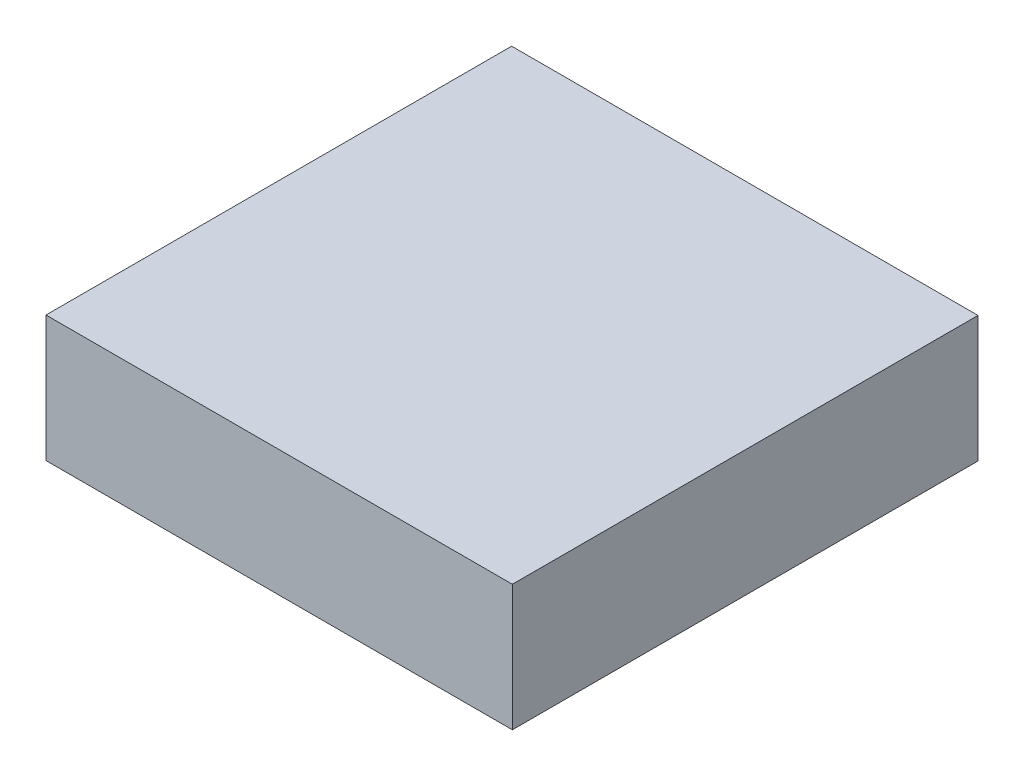
ISO-10303-21;
HEADER;
FILE_DESCRIPTION(('STEP AP214'),'2;1');
FILE_NAME('part.step','',(''),(''),'','','');
FILE_SCHEMA(('AUTOMOTIVE_DESIGN { 1 0 10303 214 1 1 1 1 }'));
ENDSEC;
DATA;
#1=APPLICATION_CONTEXT('core data for automotive mechanical design processes');
#2=APPLICATION_PROTOCOL_DEFINITION('international standard','automotive_design',2000,#1);
#3=PRODUCT_CONTEXT('',#1,'mechanical');
#4=PRODUCT('Part','Part','',(#3));
#5=PRODUCT_RELATED_PRODUCT_CATEGORY('part','',(#4));
#6=PRODUCT_DEFINITION_FORMATION('','',#4);
#7=PRODUCT_DEFINITION_CONTEXT('part definition',#1,'design');
#8=PRODUCT_DEFINITION('design','',#6,#7);
#9=PRODUCT_DEFINITION_SHAPE('','',#8);
#10=(LENGTH_UNIT() NAMED_UNIT(*) SI_UNIT(.MILLI.,.METRE.));
#11=(NAMED_UNIT(*) PLANE_ANGLE_UNIT() SI_UNIT($,.RADIAN.));
#12=(NAMED_UNIT(*) SI_UNIT($,.STERADIAN.) SOLID_ANGLE_UNIT());
#13=UNCERTAINTY_MEASURE_WITH_UNIT(LENGTH_MEASURE(1.E-05),#10,'distance_accuracy_value','');
#14=(GEOMETRIC_REPRESENTATION_CONTEXT(3) GLOBAL_UNCERTAINTY_ASSIGNED_CONTEXT((#13)) GLOBAL_UNIT_ASSIGNED_CONTEXT((#10,
#11,#12)) REPRESENTATION_CONTEXT('',''));
#15=CARTESIAN_POINT('',(0.,0.,0.));
#16=DIRECTION('',(0.,0.,1.));
#17=DIRECTION('',(1.,0.,0.));
#18=AXIS2_PLACEMENT_3D('',#15,#16,#17);
#19=CARTESIAN_POINT('',(0.,1.,0.));
#20=DIRECTION('',(0.,1.,0.));
#21=DIRECTION('',(0.,0.,1.));
#22=AXIS2_PLACEMENT_3D('',#19,#20,#21);
#23=PLANE('',#22);
#24=DIRECTION('',(1.,0.,0.));
#25=VECTOR('',#24,1.);
#26=CARTESIAN_POINT('',(-45.1650018127379,1.,-46.0180187455828));
#27=LINE('',#26,#25);
#28=CARTESIAN_POINT('',(-45.1650018127379,1.,-46.0180187455828));
#29=VERTEX_POINT('',#28);
#30=CARTESIAN_POINT('',(45.1650018127379,1.,-46.0180187455828));
#31=VERTEX_POINT('',#30);
#32=EDGE_CURVE('E165',#29,#31,#27,.T.);
#33=ORIENTED_EDGE('',*,*,#32,.T.);
#34=DIRECTION('',(0.,0.,1.));
#35=VECTOR('',#34,1.);
#36=CARTESIAN_POINT('',(45.1650018127379,1.,46.0180187455828));
#37=LINE('',#36,#35);
#38=CARTESIAN_POINT('',(45.1650018127379,1.,46.0180187455828));
#39=VERTEX_POINT('',#38);
#40=EDGE_CURVE('E188',#31,#39,#37,.T.);
#41=ORIENTED_EDGE('',*,*,#40,.T.);
#42=DIRECTION('',(-1.,0.,0.));
#43=VECTOR('',#42,1.);
#44=CARTESIAN_POINT('',(-45.1650018127379,1.,46.0180187455828));
#45=LINE('',#44,#43);
#46=CARTESIAN_POINT('',(-45.1650018127379,1.,46.0180187455828));
#47=VERTEX_POINT('',#46);
#48=EDGE_CURVE('E171',#39,#47,#45,.T.);
#49=ORIENTED_EDGE('',*,*,#48,.T.);
#50=DIRECTION('',(0.,0.,-1.));
#51=VECTOR('',#50,1.);
#52=CARTESIAN_POINT('',(-45.1650018127379,1.,46.0180187455828));
#53=LINE('',#52,#51);
#54=EDGE_CURVE('E193',#47,#29,#53,.T.);
#55=ORIENTED_EDGE('',*,*,#54,.T.);
#56=EDGE_LOOP('',(#33,#41,#49,#55));
#57=FACE_BOUND('',#56,.T.);
#58=CARTESIAN_POINT('',(-24.4178466235232,1.,12.4688207388877));
#59=DIRECTION('',(0.,1.,0.));
#60=DIRECTION('',(0.,0.,1.));
#61=AXIS2_PLACEMENT_3D('',#58,#59,#60);
#62=CIRCLE('',#61,15.8541019662497);
#63=CARTESIAN_POINT('',(-11.8736168002827,1.,22.163914719761));
#64=VERTEX_POINT('',#63);
#65=CARTESIAN_POINT('',(-26.5983195318966,1.,-3.23462114663824));
#66=VERTEX_POINT('',#65);
#67=EDGE_CURVE('E76',#64,#66,#62,.F.);
#68=ORIENTED_EDGE('',*,*,#67,.F.);
#69=CARTESIAN_POINT('',(0.110261329124484,1.,31.4259281201119));
#70=DIRECTION('',(0.,-1.,0.));
#71=DIRECTION('',(0.,0.,-1.));
#72=AXIS2_PLACEMENT_3D('',#69,#70,#71);
#73=CIRCLE('',#72,15.1458980337503);
#74=CARTESIAN_POINT('',(12.0608111713512,1.,22.1209517248051));
#75=VERTEX_POINT('',#74);
#76=EDGE_CURVE('E262',#75,#64,#73,.F.);
#77=ORIENTED_EDGE('',*,*,#76,.F.);
#78=CARTESIAN_POINT('',(24.5701543168826,1.,12.380885851127));
#79=DIRECTION('',(0.,1.,0.));
#80=DIRECTION('',(0.,0.,1.));
#81=AXIS2_PLACEMENT_3D('',#78,#79,#80);
#82=CIRCLE('',#81,15.8541019662497);
#83=CARTESIAN_POINT('',(26.6942370847762,1.,-3.3302828371463));
#84=VERTEX_POINT('',#83);
#85=EDGE_CURVE('E265',#84,#75,#82,.F.);
#86=ORIENTED_EDGE('',*,*,#85,.F.);
#87=CARTESIAN_POINT('',(28.7234369149684,1.,-18.3396324332451));
#88=DIRECTION('',(0.,-1.,0.));
#89=DIRECTION('',(0.,0.,-1.));
#90=AXIS2_PLACEMENT_3D('',#87,#88,#89);
#91=CIRCLE('',#90,15.1458980337503);
#92=CARTESIAN_POINT('',(14.6898160539048,1.,-24.0366239881521));
#93=VERTEX_POINT('',#92);
#94=EDGE_CURVE('E269',#93,#84,#91,.F.);
#95=ORIENTED_EDGE('',*,*,#94,.F.);
#96=CARTESIAN_POINT('',(0.,1.,-30.));
#97=DIRECTION('',(0.,1.,0.));
#98=DIRECTION('',(0.,0.,1.));
#99=AXIS2_PLACEMENT_3D('',#96,#97,#98);
#100=CIRCLE('',#99,15.8541019662497);
#101=CARTESIAN_POINT('',(-14.6683125911341,1.,-23.9839252926));
#102=VERTEX_POINT('',#101);
#103=EDGE_CURVE('E273',#102,#93,#100,.F.);
#104=ORIENTED_EDGE('',*,*,#103,.F.);
#105=CARTESIAN_POINT('',(-28.6813905507334,1.,-18.2365890968521));
#106=DIRECTION('',(0.,-1.,0.));
#107=DIRECTION('',(0.,0.,-1.));
#108=AXIS2_PLACEMENT_3D('',#105,#106,#107);
#109=CIRCLE('',#108,15.1458980337503);
#110=EDGE_CURVE('E277',#66,#102,#109,.F.);
#111=ORIENTED_EDGE('',*,*,#110,.F.);
#112=EDGE_LOOP('',(#68,#77,#86,#95,#104,#111));
#113=FACE_BOUND('',#112,.T.);
#114=ADVANCED_FACE('F51',(#57,#113),#23,.F.);
#115=CARTESIAN_POINT('',(-24.4178466235232,0.,12.4688207388877));
#116=DIRECTION('',(0.,1.,0.));
#117=DIRECTION('',(0.,0.,1.));
#118=AXIS2_PLACEMENT_3D('',#115,#116,#117);
#119=TOROIDAL_SURFACE('',#118,12.5,3.5);
#120=CARTESIAN_POINT('',(-14.5274805135846,0.,20.1128156506717));
#121=DIRECTION('',(0.611519592942715,0.,-0.791229288795085));
#122=DIRECTION('',(-0.791229288795086,0.,-0.611519592942715));
#123=AXIS2_PLACEMENT_3D('',#120,#121,#122);
#124=CIRCLE('',#123,3.5);
#125=CARTESIAN_POINT('',(-14.5274805135846,-3.5,20.1128156506717));
#126=VERTEX_POINT('',#125);
#127=EDGE_CURVE('E322',#64,#126,#124,.T.);
#128=ORIENTED_EDGE('',*,*,#127,.F.);
#129=ORIENTED_EDGE('',*,*,#67,.T.);
#130=CARTESIAN_POINT('',(-26.1370175619144,0.,0.0876070954442532));
#131=DIRECTION('',(-0.990497091475478,0.,0.137533675071299));
#132=DIRECTION('',(0.137533675071299,0.,0.990497091475478));
#133=AXIS2_PLACEMENT_3D('',#130,#131,#132);
#134=CIRCLE('',#133,3.5);
#135=CARTESIAN_POINT('',(-26.1370175619144,-3.5,0.0876070954442523));
#136=VERTEX_POINT('',#135);
#137=EDGE_CURVE('E319',#66,#136,#134,.T.);
#138=ORIENTED_EDGE('',*,*,#137,.T.);
#139=CARTESIAN_POINT('',(-24.4178466235232,-3.5,12.4688207388877));
#140=DIRECTION('',(0.,1.,0.));
#141=DIRECTION('',(0.,0.,1.));
#142=AXIS2_PLACEMENT_3D('',#139,#140,#141);
#143=CIRCLE('',#142,12.5);
#144=EDGE_CURVE('E283',#126,#136,#143,.F.);
#145=ORIENTED_EDGE('',*,*,#144,.F.);
#146=EDGE_LOOP('',(#128,#129,#138,#145));
#147=FACE_BOUND('',#146,.T.);
#148=ADVANCED_FACE('F372',(#147),#119,.T.);
#149=CARTESIAN_POINT('',(-28.6813905507334,0.,-18.2365890968521));
#150=DIRECTION('',(0.,-1.,0.));
#151=DIRECTION('',(0.,0.,-1.));
#152=AXIS2_PLACEMENT_3D('',#149,#150,#151);
#153=TOROIDAL_SURFACE('',#152,18.5,3.5);
#154=ORIENTED_EDGE('',*,*,#137,.F.);
#155=ORIENTED_EDGE('',*,*,#110,.T.);
#156=CARTESIAN_POINT('',(-11.5650768349732,0.,-25.2566891519565));
#157=DIRECTION('',(0.379464867843479,0.,0.925206146797853));
#158=DIRECTION('',(0.925206146797853,0.,-0.379464867843479));
#159=AXIS2_PLACEMENT_3D('',#156,#157,#158);
#160=CIRCLE('',#159,3.5);
#161=CARTESIAN_POINT('',(-11.5650768349732,-3.5,-25.2566891519565));
#162=VERTEX_POINT('',#161);
#163=EDGE_CURVE('E316',#102,#162,#160,.T.);
#164=ORIENTED_EDGE('',*,*,#163,.T.);
#165=CARTESIAN_POINT('',(-28.6813905507334,-3.5,-18.2365890968521));
#166=DIRECTION('',(0.,1.,0.));
#167=DIRECTION('',(0.,0.,1.));
#168=AXIS2_PLACEMENT_3D('',#165,#166,#167);
#169=CIRCLE('',#168,18.5);
#170=EDGE_CURVE('E287',#136,#162,#169,.T.);
#171=ORIENTED_EDGE('',*,*,#170,.F.);
#172=EDGE_LOOP('',(#154,#155,#164,#171));
#173=FACE_BOUND('',#172,.T.);
#174=ADVANCED_FACE('F380',(#173),#153,.T.);
#175=CARTESIAN_POINT('',(0.,0.,-30.));
#176=DIRECTION('',(0.,1.,0.));
#177=DIRECTION('',(0.,0.,1.));
#178=AXIS2_PLACEMENT_3D('',#175,#176,#177);
#179=TOROIDAL_SURFACE('',#178,12.5,3.5);
#180=ORIENTED_EDGE('',*,*,#163,.F.);
#181=ORIENTED_EDGE('',*,*,#103,.T.);
#182=CARTESIAN_POINT('',(11.5820310141002,0.,-25.298238884373));
#183=DIRECTION('',(0.37614088925016,0.,-0.926562481128013));
#184=DIRECTION('',(-0.926562481128013,0.,-0.37614088925016));
#185=AXIS2_PLACEMENT_3D('',#182,#183,#184);
#186=CIRCLE('',#185,3.5);
#187=CARTESIAN_POINT('',(11.5820310141002,-3.5,-25.298238884373));
#188=VERTEX_POINT('',#187);
#189=EDGE_CURVE('E313',#93,#188,#186,.T.);
#190=ORIENTED_EDGE('',*,*,#189,.T.);
#191=CARTESIAN_POINT('',(0.,-3.5,-30.));
#192=DIRECTION('',(0.,1.,0.));
#193=DIRECTION('',(0.,0.,1.));
#194=AXIS2_PLACEMENT_3D('',#191,#192,#193);
#195=CIRCLE('',#194,12.5);
#196=EDGE_CURVE('E291',#162,#188,#195,.F.);
#197=ORIENTED_EDGE('',*,*,#196,.F.);
#198=EDGE_LOOP('',(#180,#181,#190,#197));
#199=FACE_BOUND('',#198,.T.);
#200=ADVANCED_FACE('F434',(#199),#179,.T.);
#201=CARTESIAN_POINT('',(28.7234369149684,0.,-18.3396324332451));
#202=DIRECTION('',(0.,-1.,0.));
#203=DIRECTION('',(0.,0.,-1.));
#204=AXIS2_PLACEMENT_3D('',#201,#202,#203);
#205=TOROIDAL_SURFACE('',#204,18.5,3.5);
#206=ORIENTED_EDGE('',*,*,#189,.F.);
#207=ORIENTED_EDGE('',*,*,#94,.T.);
#208=CARTESIAN_POINT('',(26.2448650419172,0.,-0.00641990870043925));
#209=DIRECTION('',(-0.990984460786196,0.,-0.133976858002766));
#210=DIRECTION('',(-0.133976858002766,0.,0.990984460786196));
#211=AXIS2_PLACEMENT_3D('',#208,#209,#210);
#212=CIRCLE('',#211,3.5);
#213=CARTESIAN_POINT('',(26.2448650419172,-3.5,-0.00641990870043945));
#214=VERTEX_POINT('',#213);
#215=EDGE_CURVE('E310',#84,#214,#212,.T.);
#216=ORIENTED_EDGE('',*,*,#215,.T.);
#217=CARTESIAN_POINT('',(28.7234369149684,-3.5,-18.3396324332451));
#218=DIRECTION('',(0.,1.,0.));
#219=DIRECTION('',(0.,0.,1.));
#220=AXIS2_PLACEMENT_3D('',#217,#218,#219);
#221=CIRCLE('',#220,18.5);
#222=EDGE_CURVE('E295',#188,#214,#221,.T.);
#223=ORIENTED_EDGE('',*,*,#222,.F.);
#224=EDGE_LOOP('',(#206,#207,#216,#223));
#225=FACE_BOUND('',#224,.T.);
#226=ADVANCED_FACE('F427',(#225),#205,.T.);
#227=CARTESIAN_POINT('',(24.5701543168826,0.,12.380885851127));
#228=DIRECTION('',(0.,1.,0.));
#229=DIRECTION('',(0.,0.,1.));
#230=AXIS2_PLACEMENT_3D('',#227,#228,#229);
#231=TOROIDAL_SURFACE('',#230,12.5,3.5);
#232=ORIENTED_EDGE('',*,*,#215,.F.);
#233=ORIENTED_EDGE('',*,*,#85,.T.);
#234=CARTESIAN_POINT('',(14.7072942411737,0.,20.0603383789435));
#235=DIRECTION('',(0.61435620222532,0.,0.789028806056713));
#236=DIRECTION('',(0.789028806056713,0.,-0.61435620222532));
#237=AXIS2_PLACEMENT_3D('',#234,#235,#236);
#238=CIRCLE('',#237,3.5);
#239=CARTESIAN_POINT('',(14.7072942411737,-3.5,20.0603383789435));
#240=VERTEX_POINT('',#239);
#241=EDGE_CURVE('E307',#75,#240,#238,.T.);
#242=ORIENTED_EDGE('',*,*,#241,.T.);
#243=CARTESIAN_POINT('',(24.5701543168826,-3.5,12.380885851127));
#244=DIRECTION('',(0.,1.,0.));
#245=DIRECTION('',(0.,0.,1.));
#246=AXIS2_PLACEMENT_3D('',#243,#244,#245);
#247=CIRCLE('',#246,12.5);
#248=EDGE_CURVE('E299',#214,#240,#247,.F.);
#249=ORIENTED_EDGE('',*,*,#248,.F.);
#250=EDGE_LOOP('',(#232,#233,#242,#249));
#251=FACE_BOUND('',#250,.T.);
#252=ADVANCED_FACE('F408',(#251),#231,.T.);
#253=CARTESIAN_POINT('',(0.110261329124484,0.,31.4259281201119));
#254=DIRECTION('',(0.,-1.,0.));
#255=DIRECTION('',(0.,0.,-1.));
#256=AXIS2_PLACEMENT_3D('',#253,#254,#255);
#257=TOROIDAL_SURFACE('',#256,18.5,3.5);
#258=ORIENTED_EDGE('',*,*,#241,.F.);
#259=ORIENTED_EDGE('',*,*,#76,.T.);
#260=ORIENTED_EDGE('',*,*,#127,.T.);
#261=CARTESIAN_POINT('',(0.110261329124484,-3.5,31.4259281201119));
#262=DIRECTION('',(0.,1.,0.));
#263=DIRECTION('',(0.,0.,1.));
#264=AXIS2_PLACEMENT_3D('',#261,#262,#263);
#265=CIRCLE('',#264,18.5);
#266=EDGE_CURVE('E303',#240,#126,#265,.T.);
#267=ORIENTED_EDGE('',*,*,#266,.F.);
#268=EDGE_LOOP('',(#258,#259,#260,#267));
#269=FACE_BOUND('',#268,.T.);
#270=ADVANCED_FACE('F398',(#269),#257,.T.);
#271=CARTESIAN_POINT('',(24.5701543168826,3.5,12.380885851127));
#272=DIRECTION('',(0.,-1.,0.));
#273=DIRECTION('',(0.,0.,-1.));
#274=AXIS2_PLACEMENT_3D('',#271,#272,#273);
#275=CYLINDRICAL_SURFACE('',#274,11.);
#276=CARTESIAN_POINT('',(24.5701543168826,-3.,12.380885851127));
#277=DIRECTION('',(0.,1.,0.));
#278=DIRECTION('',(0.,0.,1.));
#279=AXIS2_PLACEMENT_3D('',#276,#277,#278);
#280=CIRCLE('',#279,11.);
#281=CARTESIAN_POINT('',(24.5701543168826,-3.,23.380885851127));
#282=VERTEX_POINT('',#281);
#283=EDGE_CURVE('E341',#282,#282,#280,.F.);
#284=ORIENTED_EDGE('',*,*,#283,.T.);
#285=EDGE_LOOP('',(#284));
#286=FACE_BOUND('',#285,.T.);
#287=CARTESIAN_POINT('',(24.5701543168826,1.,12.380885851127));
#288=DIRECTION('',(0.,1.,0.));
#289=DIRECTION('',(0.,0.,1.));
#290=AXIS2_PLACEMENT_3D('',#287,#288,#289);
#291=CIRCLE('',#290,11.);
#292=CARTESIAN_POINT('',(24.5701543168826,1.,23.380885851127));
#293=VERTEX_POINT('',#292);
#294=EDGE_CURVE('E258',#293,#293,#291,.T.);
#295=ORIENTED_EDGE('',*,*,#294,.T.);
#296=EDGE_LOOP('',(#295));
#297=FACE_BOUND('',#296,.T.);
#298=ADVANCED_FACE('F395',(#286,#297),#275,.F.);
#299=CARTESIAN_POINT('',(0.,3.5,-30.));
#300=DIRECTION('',(0.,-1.,0.));
#301=DIRECTION('',(0.,0.,-1.));
#302=AXIS2_PLACEMENT_3D('',#299,#300,#301);
#303=CYLINDRICAL_SURFACE('',#302,11.);
#304=CARTESIAN_POINT('',(0.,-3.,-30.));
#305=DIRECTION('',(0.,1.,0.));
#306=DIRECTION('',(0.,0.,1.));
#307=AXIS2_PLACEMENT_3D('',#304,#305,#306);
#308=CIRCLE('',#307,11.);
#309=CARTESIAN_POINT('',(0.,-3.,-19.));
#310=VERTEX_POINT('',#309);
#311=EDGE_CURVE('E345',#310,#310,#308,.F.);
#312=ORIENTED_EDGE('',*,*,#311,.T.);
#313=EDGE_LOOP('',(#312));
#314=FACE_BOUND('',#313,.T.);
#315=CARTESIAN_POINT('',(0.,1.,-30.));
#316=DIRECTION('',(0.,1.,0.));
#317=DIRECTION('',(0.,0.,1.));
#318=AXIS2_PLACEMENT_3D('',#315,#316,#317);
#319=CIRCLE('',#318,11.);
#320=CARTESIAN_POINT('',(0.,1.,-19.));
#321=VERTEX_POINT('',#320);
#322=EDGE_CURVE('E254',#321,#321,#319,.T.);
#323=ORIENTED_EDGE('',*,*,#322,.T.);
#324=EDGE_LOOP('',(#323));
#325=FACE_BOUND('',#324,.T.);
#326=ADVANCED_FACE('F397',(#314,#325),#303,.F.);
#327=CARTESIAN_POINT('',(0.,3.5,0.));
#328=DIRECTION('',(0.,-1.,0.));
#329=DIRECTION('',(0.,0.,-1.));
#330=AXIS2_PLACEMENT_3D('',#327,#328,#329);
#331=CYLINDRICAL_SURFACE('',#330,11.);
#332=CARTESIAN_POINT('',(0.,-3.,0.));
#333=DIRECTION('',(0.,1.,0.));
#334=DIRECTION('',(0.,0.,1.));
#335=AXIS2_PLACEMENT_3D('',#332,#333,#334);
#336=CIRCLE('',#335,11.);
#337=CARTESIAN_POINT('',(0.,-3.,11.));
#338=VERTEX_POINT('',#337);
#339=EDGE_CURVE('E11',#338,#338,#336,.F.);
#340=ORIENTED_EDGE('',*,*,#339,.T.);
#341=EDGE_LOOP('',(#340));
#342=FACE_BOUND('',#341,.T.);
#343=CARTESIAN_POINT('',(0.,1.,0.));
#344=DIRECTION('',(0.,1.,0.));
#345=DIRECTION('',(0.,0.,1.));
#346=AXIS2_PLACEMENT_3D('',#343,#344,#345);
#347=CIRCLE('',#346,11.);
#348=CARTESIAN_POINT('',(0.,1.,11.));
#349=VERTEX_POINT('',#348);
#350=EDGE_CURVE('E250',#349,#349,#347,.T.);
#351=ORIENTED_EDGE('',*,*,#350,.T.);
#352=EDGE_LOOP('',(#351));
#353=FACE_BOUND('',#352,.T.);
#354=ADVANCED_FACE('F405',(#342,#353),#331,.F.);
#355=CARTESIAN_POINT('',(-24.4178466235232,3.5,12.4688207388877));
#356=DIRECTION('',(0.,-1.,0.));
#357=DIRECTION('',(0.,0.,-1.));
#358=AXIS2_PLACEMENT_3D('',#355,#356,#357);
#359=CYLINDRICAL_SURFACE('',#358,11.);
#360=CARTESIAN_POINT('',(-24.4178466235232,-3.,12.4688207388877));
#361=DIRECTION('',(0.,1.,0.));
#362=DIRECTION('',(0.,0.,1.));
#363=AXIS2_PLACEMENT_3D('',#360,#361,#362);
#364=CIRCLE('',#363,11.);
#365=CARTESIAN_POINT('',(-24.4178466235232,-3.,23.4688207388877));
#366=VERTEX_POINT('',#365);
#367=EDGE_CURVE('E337',#366,#366,#364,.F.);
#368=ORIENTED_EDGE('',*,*,#367,.T.);
#369=EDGE_LOOP('',(#368));
#370=FACE_BOUND('',#369,.T.);
#371=CARTESIAN_POINT('',(-24.4178466235232,1.,12.4688207388877));
#372=DIRECTION('',(0.,1.,0.));
#373=DIRECTION('',(0.,0.,1.));
#374=AXIS2_PLACEMENT_3D('',#371,#372,#373);
#375=CIRCLE('',#374,11.);
#376=CARTESIAN_POINT('',(-24.4178466235232,1.,23.4688207388877));
#377=VERTEX_POINT('',#376);
#378=EDGE_CURVE('E55',#377,#377,#375,.T.);
#379=ORIENTED_EDGE('',*,*,#378,.T.);
#380=EDGE_LOOP('',(#379));
#381=FACE_BOUND('',#380,.T.);
#382=ADVANCED_FACE('F412',(#370,#381),#359,.F.);
#383=CARTESIAN_POINT('',(0.,-3.5,0.));
#384=DIRECTION('',(0.,1.,0.));
#385=DIRECTION('',(0.,0.,1.));
#386=AXIS2_PLACEMENT_3D('',#383,#384,#385);
#387=PLANE('',#386);
#388=CARTESIAN_POINT('',(0.,-3.5,0.));
#389=DIRECTION('',(0.,1.,0.));
#390=DIRECTION('',(0.,0.,1.));
#391=AXIS2_PLACEMENT_3D('',#388,#389,#390);
#392=CIRCLE('',#391,11.5);
#393=CARTESIAN_POINT('',(0.,-3.5,11.5));
#394=VERTEX_POINT('',#393);
#395=EDGE_CURVE('E61',#394,#394,#392,.T.);
#396=ORIENTED_EDGE('',*,*,#395,.T.);
#397=EDGE_LOOP('',(#396));
#398=FACE_BOUND('',#397,.T.);
#399=CARTESIAN_POINT('',(-24.4178466235232,-3.5,12.4688207388877));
#400=DIRECTION('',(0.,1.,0.));
#401=DIRECTION('',(0.,0.,1.));
#402=AXIS2_PLACEMENT_3D('',#399,#400,#401);
#403=CIRCLE('',#402,11.5);
#404=CARTESIAN_POINT('',(-24.4178466235232,-3.5,23.9688207388877));
#405=VERTEX_POINT('',#404);
#406=EDGE_CURVE('E333',#405,#405,#403,.T.);
#407=ORIENTED_EDGE('',*,*,#406,.T.);
#408=EDGE_LOOP('',(#407));
#409=FACE_BOUND('',#408,.T.);
#410=CARTESIAN_POINT('',(24.5701543168826,-3.5,12.380885851127));
#411=DIRECTION('',(0.,1.,0.));
#412=DIRECTION('',(0.,0.,1.));
#413=AXIS2_PLACEMENT_3D('',#410,#411,#412);
#414=CIRCLE('',#413,11.5);
#415=CARTESIAN_POINT('',(24.5701543168826,-3.5,23.880885851127));
#416=VERTEX_POINT('',#415);
#417=EDGE_CURVE('E329',#416,#416,#414,.T.);
#418=ORIENTED_EDGE('',*,*,#417,.T.);
#419=EDGE_LOOP('',(#418));
#420=FACE_BOUND('',#419,.T.);
#421=CARTESIAN_POINT('',(0.,-3.5,-30.));
#422=DIRECTION('',(0.,1.,0.));
#423=DIRECTION('',(0.,0.,1.));
#424=AXIS2_PLACEMENT_3D('',#421,#422,#423);
#425=CIRCLE('',#424,11.5);
#426=CARTESIAN_POINT('',(0.,-3.5,-18.5));
#427=VERTEX_POINT('',#426);
#428=EDGE_CURVE('E325',#427,#427,#425,.T.);
#429=ORIENTED_EDGE('',*,*,#428,.T.);
#430=EDGE_LOOP('',(#429));
#431=FACE_BOUND('',#430,.T.);
#432=ORIENTED_EDGE('',*,*,#248,.T.);
#433=ORIENTED_EDGE('',*,*,#266,.T.);
#434=ORIENTED_EDGE('',*,*,#144,.T.);
#435=ORIENTED_EDGE('',*,*,#170,.T.);
#436=ORIENTED_EDGE('',*,*,#196,.T.);
#437=ORIENTED_EDGE('',*,*,#222,.T.);
#438=EDGE_LOOP('',(#432,#433,#434,#435,#436,#437));
#439=FACE_BOUND('',#438,.T.);
#440=ADVANCED_FACE('F353',(#398,#409,#420,#431,#439),#387,.F.);
#441=CARTESIAN_POINT('',(-24.4178466235232,-3.,12.4688207388877));
#442=DIRECTION('',(0.,1.,0.));
#443=DIRECTION('',(0.,0.,1.));
#444=AXIS2_PLACEMENT_3D('',#441,#442,#443);
#445=TOROIDAL_SURFACE('',#444,11.5,0.5);
#446=ORIENTED_EDGE('',*,*,#367,.F.);
#447=EDGE_LOOP('',(#446));
#448=FACE_BOUND('',#447,.T.);
#449=ORIENTED_EDGE('',*,*,#406,.F.);
#450=EDGE_LOOP('',(#449));
#451=FACE_BOUND('',#450,.T.);
#452=ADVANCED_FACE('F450',(#448,#451),#445,.T.);
#453=CARTESIAN_POINT('',(24.5701543168826,-3.,12.380885851127));
#454=DIRECTION('',(0.,1.,0.));
#455=DIRECTION('',(0.,0.,1.));
#456=AXIS2_PLACEMENT_3D('',#453,#454,#455);
#457=TOROIDAL_SURFACE('',#456,11.5,0.5);
#458=ORIENTED_EDGE('',*,*,#283,.F.);
#459=EDGE_LOOP('',(#458));
#460=FACE_BOUND('',#459,.T.);
#461=ORIENTED_EDGE('',*,*,#417,.F.);
#462=EDGE_LOOP('',(#461));
#463=FACE_BOUND('',#462,.T.);
#464=ADVANCED_FACE('F368',(#460,#463),#457,.T.);
#465=CARTESIAN_POINT('',(0.,-3.,-30.));
#466=DIRECTION('',(0.,1.,0.));
#467=DIRECTION('',(0.,0.,1.));
#468=AXIS2_PLACEMENT_3D('',#465,#466,#467);
#469=TOROIDAL_SURFACE('',#468,11.5,0.5);
#470=ORIENTED_EDGE('',*,*,#311,.F.);
#471=EDGE_LOOP('',(#470));
#472=FACE_BOUND('',#471,.T.);
#473=ORIENTED_EDGE('',*,*,#428,.F.);
#474=EDGE_LOOP('',(#473));
#475=FACE_BOUND('',#474,.T.);
#476=ADVANCED_FACE('F358',(#472,#475),#469,.T.);
#477=CARTESIAN_POINT('',(0.,-3.,0.));
#478=DIRECTION('',(0.,1.,0.));
#479=DIRECTION('',(0.,0.,1.));
#480=AXIS2_PLACEMENT_3D('',#477,#478,#479);
#481=TOROIDAL_SURFACE('',#480,11.5,0.5);
#482=ORIENTED_EDGE('',*,*,#339,.F.);
#483=EDGE_LOOP('',(#482));
#484=FACE_BOUND('',#483,.T.);
#485=ORIENTED_EDGE('',*,*,#395,.F.);
#486=EDGE_LOOP('',(#485));
#487=FACE_BOUND('',#486,.T.);
#488=ADVANCED_FACE('F53',(#484,#487),#481,.T.);
#489=ORIENTED_EDGE('',*,*,#378,.F.);
#490=EDGE_LOOP('',(#489));
#491=FACE_BOUND('',#490,.T.);
#492=ADVANCED_FACE('F357',(#491),#23,.F.);
#493=ORIENTED_EDGE('',*,*,#350,.F.);
#494=EDGE_LOOP('',(#493));
#495=FACE_BOUND('',#494,.T.);
#496=ADVANCED_FACE('F365',(#495),#23,.F.);
#497=ORIENTED_EDGE('',*,*,#322,.F.);
#498=EDGE_LOOP('',(#497));
#499=FACE_BOUND('',#498,.T.);
#500=ADVANCED_FACE('F385',(#499),#23,.F.);
#501=ORIENTED_EDGE('',*,*,#294,.F.);
#502=EDGE_LOOP('',(#501));
#503=FACE_BOUND('',#502,.T.);
#504=ADVANCED_FACE('F374',(#503),#23,.F.);
#505=CARTESIAN_POINT('',(0.,-16.,0.));
#506=DIRECTION('',(0.,-1.,0.));
#507=DIRECTION('',(0.,0.,-1.));
#508=AXIS2_PLACEMENT_3D('',#505,#506,#507);
#509=PLANE('',#508);
#510=DIRECTION('',(0.,0.,1.));
#511=VECTOR('',#510,1.);
#512=CARTESIAN_POINT('',(50.8603350721658,-16.,50.7829583548122));
#513=LINE('',#512,#511);
#514=CARTESIAN_POINT('',(50.8603350721658,-16.,-50.7829583548122));
#515=VERTEX_POINT('',#514);
#516=CARTESIAN_POINT('',(50.8603350721658,-16.,50.7829583548122));
#517=VERTEX_POINT('',#516);
#518=EDGE_CURVE('E173',#515,#517,#513,.T.);
#519=ORIENTED_EDGE('',*,*,#518,.T.);
#520=DIRECTION('',(-1.,0.,0.));
#521=VECTOR('',#520,1.);
#522=CARTESIAN_POINT('',(-50.8603350721658,-16.,50.7829583548122));
#523=LINE('',#522,#521);
#524=CARTESIAN_POINT('',(-50.8603350721658,-16.,50.7829583548122));
#525=VERTEX_POINT('',#524);
#526=EDGE_CURVE('E210',#517,#525,#523,.T.);
#527=ORIENTED_EDGE('',*,*,#526,.T.);
#528=DIRECTION('',(0.,0.,-1.));
#529=VECTOR('',#528,1.);
#530=CARTESIAN_POINT('',(-50.8603350721658,-16.,50.7829583548122));
#531=LINE('',#530,#529);
#532=CARTESIAN_POINT('',(-50.8603350721658,-16.,-50.7829583548122));
#533=VERTEX_POINT('',#532);
#534=EDGE_CURVE('E214',#525,#533,#531,.T.);
#535=ORIENTED_EDGE('',*,*,#534,.T.);
#536=DIRECTION('',(1.,0.,0.));
#537=VECTOR('',#536,1.);
#538=CARTESIAN_POINT('',(-50.8603350721658,-16.,-50.7829583548122));
#539=LINE('',#538,#537);
#540=EDGE_CURVE('E218',#533,#515,#539,.T.);
#541=ORIENTED_EDGE('',*,*,#540,.T.);
#542=EDGE_LOOP('',(#519,#527,#535,#541));
#543=FACE_BOUND('',#542,.T.);
#544=DIRECTION('',(-1.,0.,0.));
#545=VECTOR('',#544,1.);
#546=CARTESIAN_POINT('',(-45.1650018127379,-16.,46.0180187455828));
#547=LINE('',#546,#545);
#548=CARTESIAN_POINT('',(45.1650018127379,-16.,46.0180187455828));
#549=VERTEX_POINT('',#548);
#550=CARTESIAN_POINT('',(-45.1650018127379,-16.,46.0180187455828));
#551=VERTEX_POINT('',#550);
#552=EDGE_CURVE('E164',#549,#551,#547,.T.);
#553=ORIENTED_EDGE('',*,*,#552,.F.);
#554=DIRECTION('',(0.,0.,1.));
#555=VECTOR('',#554,1.);
#556=CARTESIAN_POINT('',(45.1650018127379,-16.,46.0180187455828));
#557=LINE('',#556,#555);
#558=CARTESIAN_POINT('',(45.1650018127379,-16.,-46.0180187455828));
#559=VERTEX_POINT('',#558);
#560=EDGE_CURVE('E155',#559,#549,#557,.T.);
#561=ORIENTED_EDGE('',*,*,#560,.F.);
#562=DIRECTION('',(1.,0.,0.));
#563=VECTOR('',#562,1.);
#564=CARTESIAN_POINT('',(-45.1650018127379,-16.,-46.0180187455828));
#565=LINE('',#564,#563);
#566=CARTESIAN_POINT('',(-45.1650018127379,-16.,-46.0180187455828));
#567=VERTEX_POINT('',#566);
#568=EDGE_CURVE('E183',#567,#559,#565,.T.);
#569=ORIENTED_EDGE('',*,*,#568,.F.);
#570=DIRECTION('',(0.,0.,-1.));
#571=VECTOR('',#570,1.);
#572=CARTESIAN_POINT('',(-45.1650018127379,-16.,46.0180187455828));
#573=LINE('',#572,#571);
#574=EDGE_CURVE('E179',#551,#567,#573,.T.);
#575=ORIENTED_EDGE('',*,*,#574,.F.);
#576=EDGE_LOOP('',(#553,#561,#569,#575));
#577=FACE_BOUND('',#576,.T.);
#578=ADVANCED_FACE('F177',(#543,#577),#509,.T.);
#579=CARTESIAN_POINT('',(45.1650018127379,-16.,46.0180187455828));
#580=DIRECTION('',(-1.,0.,0.));
#581=DIRECTION('',(0.,0.,1.));
#582=AXIS2_PLACEMENT_3D('',#579,#580,#581);
#583=PLANE('',#582);
#584=ORIENTED_EDGE('',*,*,#40,.F.);
#585=DIRECTION('',(0.,1.,0.));
#586=VECTOR('',#585,1.);
#587=CARTESIAN_POINT('',(45.1650018127379,-16.,-46.0180187455828));
#588=LINE('',#587,#586);
#589=EDGE_CURVE('E68',#559,#31,#588,.T.);
#590=ORIENTED_EDGE('',*,*,#589,.F.);
#591=ORIENTED_EDGE('',*,*,#560,.T.);
#592=DIRECTION('',(0.,1.,0.));
#593=VECTOR('',#592,1.);
#594=CARTESIAN_POINT('',(45.1650018127379,-16.,46.0180187455828));
#595=LINE('',#594,#593);
#596=EDGE_CURVE('E158',#549,#39,#595,.T.);
#597=ORIENTED_EDGE('',*,*,#596,.T.);
#598=EDGE_LOOP('',(#584,#590,#591,#597));
#599=FACE_BOUND('',#598,.T.);
#600=ADVANCED_FACE('F157',(#599),#583,.T.);
#601=CARTESIAN_POINT('',(-45.1650018127379,-16.,46.0180187455828));
#602=DIRECTION('',(0.,0.,-1.));
#603=DIRECTION('',(-1.,0.,0.));
#604=AXIS2_PLACEMENT_3D('',#601,#602,#603);
#605=PLANE('',#604);
#606=ORIENTED_EDGE('',*,*,#48,.F.);
#607=ORIENTED_EDGE('',*,*,#596,.F.);
#608=ORIENTED_EDGE('',*,*,#552,.T.);
#609=DIRECTION('',(0.,1.,0.));
#610=VECTOR('',#609,1.);
#611=CARTESIAN_POINT('',(-45.1650018127379,-16.,46.0180187455828));
#612=LINE('',#611,#610);
#613=EDGE_CURVE('E174',#551,#47,#612,.T.);
#614=ORIENTED_EDGE('',*,*,#613,.T.);
#615=EDGE_LOOP('',(#606,#607,#608,#614));
#616=FACE_BOUND('',#615,.T.);
#617=ADVANCED_FACE('F168',(#616),#605,.T.);
#618=CARTESIAN_POINT('',(-45.1650018127379,-16.,46.0180187455828));
#619=DIRECTION('',(1.,0.,0.));
#620=DIRECTION('',(0.,0.,-1.));
#621=AXIS2_PLACEMENT_3D('',#618,#619,#620);
#622=PLANE('',#621);
#623=ORIENTED_EDGE('',*,*,#54,.F.);
#624=ORIENTED_EDGE('',*,*,#613,.F.);
#625=ORIENTED_EDGE('',*,*,#574,.T.);
#626=DIRECTION('',(0.,1.,0.));
#627=VECTOR('',#626,1.);
#628=CARTESIAN_POINT('',(-45.1650018127379,-16.,-46.0180187455828));
#629=LINE('',#628,#627);
#630=EDGE_CURVE('E202',#567,#29,#629,.T.);
#631=ORIENTED_EDGE('',*,*,#630,.T.);
#632=EDGE_LOOP('',(#623,#624,#625,#631));
#633=FACE_BOUND('',#632,.T.);
#634=ADVANCED_FACE('F515',(#633),#622,.T.);
#635=CARTESIAN_POINT('',(-45.1650018127379,-16.,-46.0180187455828));
#636=DIRECTION('',(0.,0.,1.));
#637=DIRECTION('',(1.,0.,0.));
#638=AXIS2_PLACEMENT_3D('',#635,#636,#637);
#639=PLANE('',#638);
#640=ORIENTED_EDGE('',*,*,#32,.F.);
#641=ORIENTED_EDGE('',*,*,#630,.F.);
#642=ORIENTED_EDGE('',*,*,#568,.T.);
#643=ORIENTED_EDGE('',*,*,#589,.T.);
#644=EDGE_LOOP('',(#640,#641,#642,#643));
#645=FACE_BOUND('',#644,.T.);
#646=ADVANCED_FACE('F511',(#645),#639,.T.);
#647=CARTESIAN_POINT('',(0.,11.5,0.));
#648=DIRECTION('',(0.,1.,0.));
#649=DIRECTION('',(0.,0.,1.));
#650=AXIS2_PLACEMENT_3D('',#647,#648,#649);
#651=PLANE('',#650);
#652=DIRECTION('',(0.,0.,-1.));
#653=VECTOR('',#652,1.);
#654=CARTESIAN_POINT('',(50.8603350721658,11.5,-50.7829583548122));
#655=LINE('',#654,#653);
#656=CARTESIAN_POINT('',(50.8603350721658,11.5,50.7829583548122));
#657=VERTEX_POINT('',#656);
#658=CARTESIAN_POINT('',(50.8603350721658,11.5,-50.7829583548122));
#659=VERTEX_POINT('',#658);
#660=EDGE_CURVE('E222',#657,#659,#655,.T.);
#661=ORIENTED_EDGE('',*,*,#660,.T.);
#662=DIRECTION('',(-1.,0.,0.));
#663=VECTOR('',#662,1.);
#664=CARTESIAN_POINT('',(-50.8603350721658,11.5,-50.7829583548122));
#665=LINE('',#664,#663);
#666=CARTESIAN_POINT('',(-50.8603350721658,11.5,-50.7829583548122));
#667=VERTEX_POINT('',#666);
#668=EDGE_CURVE('E226',#659,#667,#665,.T.);
#669=ORIENTED_EDGE('',*,*,#668,.T.);
#670=DIRECTION('',(0.,0.,1.));
#671=VECTOR('',#670,1.);
#672=CARTESIAN_POINT('',(-50.8603350721658,11.5,-50.7829583548122));
#673=LINE('',#672,#671);
#674=CARTESIAN_POINT('',(-50.8603350721658,11.5,50.7829583548122));
#675=VERTEX_POINT('',#674);
#676=EDGE_CURVE('E230',#667,#675,#673,.T.);
#677=ORIENTED_EDGE('',*,*,#676,.T.);
#678=DIRECTION('',(1.,0.,0.));
#679=VECTOR('',#678,1.);
#680=CARTESIAN_POINT('',(-50.8603350721658,11.5,50.7829583548122));
#681=LINE('',#680,#679);
#682=EDGE_CURVE('E234',#675,#657,#681,.T.);
#683=ORIENTED_EDGE('',*,*,#682,.T.);
#684=EDGE_LOOP('',(#661,#669,#677,#683));
#685=FACE_BOUND('',#684,.T.);
#686=ADVANCED_FACE('F493',(#685),#651,.T.);
#687=CARTESIAN_POINT('',(-50.8603350721658,1.,-50.7829583548122));
#688=DIRECTION('',(0.,0.,-1.));
#689=DIRECTION('',(-1.,0.,0.));
#690=AXIS2_PLACEMENT_3D('',#687,#688,#689);
#691=PLANE('',#690);
#692=DIRECTION('',(0.,1.,0.));
#693=VECTOR('',#692,1.);
#694=CARTESIAN_POINT('',(-50.8603350721658,1.,-50.7829583548122));
#695=LINE('',#694,#693);
#696=EDGE_CURVE('E245',#533,#667,#695,.T.);
#697=ORIENTED_EDGE('',*,*,#696,.T.);
#698=ORIENTED_EDGE('',*,*,#668,.F.);
#699=DIRECTION('',(0.,1.,0.));
#700=VECTOR('',#699,1.);
#701=CARTESIAN_POINT('',(50.8603350721658,1.,-50.7829583548122));
#702=LINE('',#701,#700);
#703=EDGE_CURVE('E238',#515,#659,#702,.T.);
#704=ORIENTED_EDGE('',*,*,#703,.F.);
#705=ORIENTED_EDGE('',*,*,#540,.F.);
#706=EDGE_LOOP('',(#697,#698,#704,#705));
#707=FACE_BOUND('',#706,.T.);
#708=ADVANCED_FACE('F489',(#707),#691,.T.);
#709=CARTESIAN_POINT('',(-50.8603350721658,1.,-50.7829583548122));
#710=DIRECTION('',(-1.,0.,0.));
#711=DIRECTION('',(0.,0.,1.));
#712=AXIS2_PLACEMENT_3D('',#709,#710,#711);
#713=PLANE('',#712);
#714=DIRECTION('',(0.,1.,0.));
#715=VECTOR('',#714,1.);
#716=CARTESIAN_POINT('',(-50.8603350721658,1.,50.7829583548122));
#717=LINE('',#716,#715);
#718=EDGE_CURVE('E242',#525,#675,#717,.T.);
#719=ORIENTED_EDGE('',*,*,#718,.T.);
#720=ORIENTED_EDGE('',*,*,#676,.F.);
#721=ORIENTED_EDGE('',*,*,#696,.F.);
#722=ORIENTED_EDGE('',*,*,#534,.F.);
#723=EDGE_LOOP('',(#719,#720,#721,#722));
#724=FACE_BOUND('',#723,.T.);
#725=ADVANCED_FACE('F492',(#724),#713,.T.);
#726=CARTESIAN_POINT('',(-50.8603350721658,1.,50.7829583548122));
#727=DIRECTION('',(0.,0.,1.));
#728=DIRECTION('',(1.,0.,0.));
#729=AXIS2_PLACEMENT_3D('',#726,#727,#728);
#730=PLANE('',#729);
#731=DIRECTION('',(0.,1.,0.));
#732=VECTOR('',#731,1.);
#733=CARTESIAN_POINT('',(50.8603350721658,1.,50.7829583548122));
#734=LINE('',#733,#732);
#735=EDGE_CURVE('E239',#517,#657,#734,.T.);
#736=ORIENTED_EDGE('',*,*,#735,.T.);
#737=ORIENTED_EDGE('',*,*,#682,.F.);
#738=ORIENTED_EDGE('',*,*,#718,.F.);
#739=ORIENTED_EDGE('',*,*,#526,.F.);
#740=EDGE_LOOP('',(#736,#737,#738,#739));
#741=FACE_BOUND('',#740,.T.);
#742=ADVANCED_FACE('F487',(#741),#730,.T.);
#743=CARTESIAN_POINT('',(50.8603350721658,1.,-50.7829583548122));
#744=DIRECTION('',(1.,0.,0.));
#745=DIRECTION('',(0.,0.,-1.));
#746=AXIS2_PLACEMENT_3D('',#743,#744,#745);
#747=PLANE('',#746);
#748=ORIENTED_EDGE('',*,*,#703,.T.);
#749=ORIENTED_EDGE('',*,*,#660,.F.);
#750=ORIENTED_EDGE('',*,*,#735,.F.);
#751=ORIENTED_EDGE('',*,*,#518,.F.);
#752=EDGE_LOOP('',(#748,#749,#750,#751));
#753=FACE_BOUND('',#752,.T.);
#754=ADVANCED_FACE('F484',(#753),#747,.T.);
#755=CLOSED_SHELL('',(#114,#148,#174,#200,#226,#252,#270,#298,#326,#354,#382,#440,#452,#464,
#476,#488,#492,#496,#500,#504,#578,#600,#617,#634,#646,#686,#708,#725,#742,#754));
#756=MANIFOLD_SOLID_BREP('B2',#755);
#757=ADVANCED_BREP_SHAPE_REPRESENTATION('',(#18,#756),#14);
#758=SHAPE_DEFINITION_REPRESENTATION(#9,#757);
ENDSEC;
END-ISO-10303-21;
